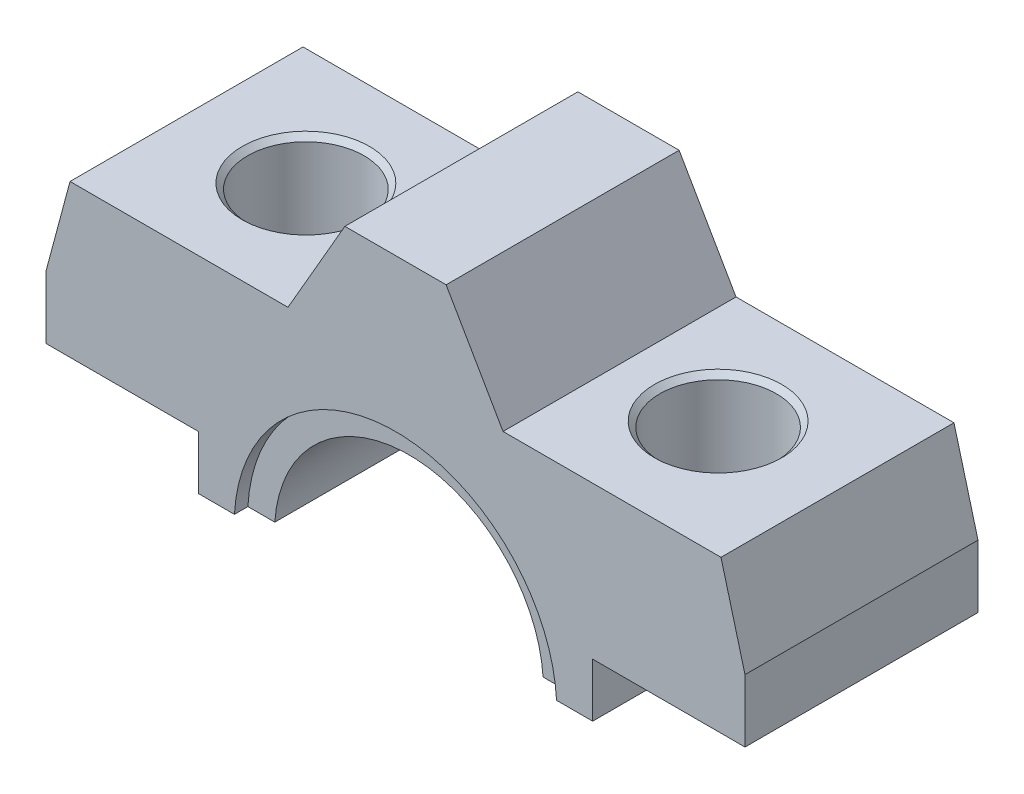
ISO-10303-21;
HEADER;
FILE_DESCRIPTION(('STEP AP214'),'2;1');
FILE_NAME('part.step','',(''),(''),'','','');
FILE_SCHEMA(('AUTOMOTIVE_DESIGN { 1 0 10303 214 1 1 1 1 }'));
ENDSEC;
DATA;
#1=APPLICATION_CONTEXT('core data for automotive mechanical design processes');
#2=APPLICATION_PROTOCOL_DEFINITION('international standard','automotive_design',2000,#1);
#3=PRODUCT_CONTEXT('',#1,'mechanical');
#4=PRODUCT('Part','Part','',(#3));
#5=PRODUCT_RELATED_PRODUCT_CATEGORY('part','',(#4));
#6=PRODUCT_DEFINITION_FORMATION('','',#4);
#7=PRODUCT_DEFINITION_CONTEXT('part definition',#1,'design');
#8=PRODUCT_DEFINITION('design','',#6,#7);
#9=PRODUCT_DEFINITION_SHAPE('','',#8);
#10=(LENGTH_UNIT() NAMED_UNIT(*) SI_UNIT(.MILLI.,.METRE.));
#11=(NAMED_UNIT(*) PLANE_ANGLE_UNIT() SI_UNIT($,.RADIAN.));
#12=(NAMED_UNIT(*) SI_UNIT($,.STERADIAN.) SOLID_ANGLE_UNIT());
#13=UNCERTAINTY_MEASURE_WITH_UNIT(LENGTH_MEASURE(1.E-05),#10,'distance_accuracy_value','');
#14=(GEOMETRIC_REPRESENTATION_CONTEXT(3) GLOBAL_UNCERTAINTY_ASSIGNED_CONTEXT((#13)) GLOBAL_UNIT_ASSIGNED_CONTEXT((#10,
#11,#12)) REPRESENTATION_CONTEXT('',''));
#15=CARTESIAN_POINT('',(0.,0.,0.));
#16=DIRECTION('',(0.,0.,1.));
#17=DIRECTION('',(1.,0.,0.));
#18=AXIS2_PLACEMENT_3D('',#15,#16,#17);
#19=CARTESIAN_POINT('',(22.,1.,-26.));
#20=DIRECTION('',(1.,0.,0.));
#21=DIRECTION('',(0.,0.,-1.));
#22=AXIS2_PLACEMENT_3D('',#19,#20,#21);
#23=PLANE('',#22);
#24=DIRECTION('',(0.,1.,0.));
#25=VECTOR('',#24,1.);
#26=CARTESIAN_POINT('',(22.,1.,-19.4226162893326));
#27=LINE('',#26,#25);
#28=CARTESIAN_POINT('',(22.,1.,-19.4226162893326));
#29=VERTEX_POINT('',#28);
#30=CARTESIAN_POINT('',(22.,7.,-19.4226162893326));
#31=VERTEX_POINT('',#30);
#32=EDGE_CURVE('E199',#29,#31,#27,.T.);
#33=ORIENTED_EDGE('',*,*,#32,.F.);
#34=DIRECTION('',(0.,0.,1.));
#35=VECTOR('',#34,1.);
#36=CARTESIAN_POINT('',(22.,1.,-26.));
#37=LINE('',#36,#35);
#38=CARTESIAN_POINT('',(22.,1.,-26.));
#39=VERTEX_POINT('',#38);
#40=EDGE_CURVE('E209',#39,#29,#37,.T.);
#41=ORIENTED_EDGE('',*,*,#40,.F.);
#42=DIRECTION('',(0.,1.,0.));
#43=VECTOR('',#42,1.);
#44=CARTESIAN_POINT('',(22.,1.,-26.));
#45=LINE('',#44,#43);
#46=CARTESIAN_POINT('',(22.,7.,-26.));
#47=VERTEX_POINT('',#46);
#48=EDGE_CURVE('E420',#39,#47,#45,.T.);
#49=ORIENTED_EDGE('',*,*,#48,.T.);
#50=DIRECTION('',(0.,0.,1.));
#51=VECTOR('',#50,1.);
#52=CARTESIAN_POINT('',(22.,7.,-26.));
#53=LINE('',#52,#51);
#54=EDGE_CURVE('E211',#47,#31,#53,.T.);
#55=ORIENTED_EDGE('',*,*,#54,.T.);
#56=EDGE_LOOP('',(#33,#41,#49,#55));
#57=FACE_BOUND('',#56,.T.);
#58=ADVANCED_FACE('F37',(#57),#23,.T.);
#59=CARTESIAN_POINT('',(-22.,7.,-26.));
#60=DIRECTION('',(-1.,0.,0.));
#61=DIRECTION('',(0.,0.,1.));
#62=AXIS2_PLACEMENT_3D('',#59,#60,#61);
#63=PLANE('',#62);
#64=DIRECTION('',(0.,1.,0.));
#65=VECTOR('',#64,1.);
#66=CARTESIAN_POINT('',(-22.,1.,-6.57738371066743));
#67=LINE('',#66,#65);
#68=CARTESIAN_POINT('',(-22.,1.,-6.57738371066743));
#69=VERTEX_POINT('',#68);
#70=CARTESIAN_POINT('',(-22.,7.,-6.57738371066743));
#71=VERTEX_POINT('',#70);
#72=EDGE_CURVE('E60',#69,#71,#67,.T.);
#73=ORIENTED_EDGE('',*,*,#72,.F.);
#74=DIRECTION('',(0.,0.,1.));
#75=VECTOR('',#74,1.);
#76=CARTESIAN_POINT('',(-22.,1.,-26.));
#77=LINE('',#76,#75);
#78=CARTESIAN_POINT('',(-22.,1.,0.));
#79=VERTEX_POINT('',#78);
#80=EDGE_CURVE('E227',#69,#79,#77,.T.);
#81=ORIENTED_EDGE('',*,*,#80,.T.);
#82=DIRECTION('',(0.,-1.,0.));
#83=VECTOR('',#82,1.);
#84=CARTESIAN_POINT('',(-22.,7.,0.));
#85=LINE('',#84,#83);
#86=CARTESIAN_POINT('',(-22.,7.,0.));
#87=VERTEX_POINT('',#86);
#88=EDGE_CURVE('E435',#87,#79,#85,.T.);
#89=ORIENTED_EDGE('',*,*,#88,.F.);
#90=DIRECTION('',(0.,0.,1.));
#91=VECTOR('',#90,1.);
#92=CARTESIAN_POINT('',(-22.,7.,-26.));
#93=LINE('',#92,#91);
#94=EDGE_CURVE('E231',#71,#87,#93,.T.);
#95=ORIENTED_EDGE('',*,*,#94,.F.);
#96=EDGE_LOOP('',(#73,#81,#89,#95));
#97=FACE_BOUND('',#96,.T.);
#98=ADVANCED_FACE('F264',(#97),#63,.T.);
#99=CARTESIAN_POINT('',(0.,0.,-26.));
#100=DIRECTION('',(0.,0.,1.));
#101=DIRECTION('',(1.,0.,0.));
#102=AXIS2_PLACEMENT_3D('',#99,#100,#101);
#103=CYLINDRICAL_SURFACE('',#102,15.);
#104=CARTESIAN_POINT('',(0.,0.,-24.5));
#105=DIRECTION('',(0.,0.,-1.));
#106=DIRECTION('',(-1.,0.,0.));
#107=AXIS2_PLACEMENT_3D('',#104,#105,#106);
#108=CIRCLE('',#107,15.);
#109=CARTESIAN_POINT('',(14.9666295470958,1.,-24.5));
#110=VERTEX_POINT('',#109);
#111=CARTESIAN_POINT('',(-14.9666295470958,1.,-24.5));
#112=VERTEX_POINT('',#111);
#113=EDGE_CURVE('E386',#110,#112,#108,.F.);
#114=ORIENTED_EDGE('',*,*,#113,.F.);
#115=DIRECTION('',(0.,0.,1.));
#116=VECTOR('',#115,1.);
#117=CARTESIAN_POINT('',(14.9666295470958,1.,-26.));
#118=LINE('',#117,#116);
#119=CARTESIAN_POINT('',(14.9666295470958,1.,-1.5));
#120=VERTEX_POINT('',#119);
#121=EDGE_CURVE('E409',#110,#120,#118,.T.);
#122=ORIENTED_EDGE('',*,*,#121,.T.);
#123=CARTESIAN_POINT('',(0.,0.,-1.5));
#124=DIRECTION('',(0.,0.,1.));
#125=DIRECTION('',(1.,0.,0.));
#126=AXIS2_PLACEMENT_3D('',#123,#124,#125);
#127=CIRCLE('',#126,15.);
#128=CARTESIAN_POINT('',(-14.9666295470958,1.,-1.50000000000001));
#129=VERTEX_POINT('',#128);
#130=EDGE_CURVE('E236',#129,#120,#127,.F.);
#131=ORIENTED_EDGE('',*,*,#130,.F.);
#132=DIRECTION('',(0.,0.,1.));
#133=VECTOR('',#132,1.);
#134=CARTESIAN_POINT('',(-14.9666295470958,1.,-26.));
#135=LINE('',#134,#133);
#136=EDGE_CURVE('E406',#129,#112,#135,.F.);
#137=ORIENTED_EDGE('',*,*,#136,.T.);
#138=EDGE_LOOP('',(#114,#122,#131,#137));
#139=FACE_BOUND('',#138,.T.);
#140=ADVANCED_FACE('F270',(#139),#103,.F.);
#141=CARTESIAN_POINT('',(-22.,1.,-26.));
#142=DIRECTION('',(0.,-1.,0.));
#143=DIRECTION('',(0.,0.,-1.));
#144=AXIS2_PLACEMENT_3D('',#141,#142,#143);
#145=PLANE('',#144);
#146=CARTESIAN_POINT('',(23.,1.,-13.));
#147=DIRECTION('',(0.,1.,0.));
#148=DIRECTION('',(0.,0.,1.));
#149=AXIS2_PLACEMENT_3D('',#146,#147,#148);
#150=CIRCLE('',#149,6.5);
#151=CARTESIAN_POINT('',(22.,1.,-6.57738371066743));
#152=VERTEX_POINT('',#151);
#153=EDGE_CURVE('E196',#29,#152,#150,.T.);
#154=ORIENTED_EDGE('',*,*,#153,.T.);
#155=CARTESIAN_POINT('',(22.,1.,0.));
#156=VERTEX_POINT('',#155);
#157=EDGE_CURVE('E219',#152,#156,#37,.T.);
#158=ORIENTED_EDGE('',*,*,#157,.T.);
#159=DIRECTION('',(1.,0.,0.));
#160=VECTOR('',#159,1.);
#161=CARTESIAN_POINT('',(-22.,1.,0.));
#162=LINE('',#161,#160);
#163=CARTESIAN_POINT('',(17.9722007556114,1.,0.));
#164=VERTEX_POINT('',#163);
#165=EDGE_CURVE('E306',#164,#156,#162,.T.);
#166=ORIENTED_EDGE('',*,*,#165,.F.);
#167=DIRECTION('',(0.,0.,1.));
#168=VECTOR('',#167,1.);
#169=CARTESIAN_POINT('',(17.9722007556114,1.,-1.5));
#170=LINE('',#169,#168);
#171=CARTESIAN_POINT('',(17.9722007556114,1.,-1.5));
#172=VERTEX_POINT('',#171);
#173=EDGE_CURVE('E404',#172,#164,#170,.T.);
#174=ORIENTED_EDGE('',*,*,#173,.F.);
#175=DIRECTION('',(-1.,0.,0.));
#176=VECTOR('',#175,1.);
#177=CARTESIAN_POINT('',(-22.,1.,-1.5));
#178=LINE('',#177,#176);
#179=EDGE_CURVE('E399',#172,#120,#178,.T.);
#180=ORIENTED_EDGE('',*,*,#179,.T.);
#181=ORIENTED_EDGE('',*,*,#121,.F.);
#182=DIRECTION('',(1.,0.,0.));
#183=VECTOR('',#182,1.);
#184=CARTESIAN_POINT('',(-22.,1.,-24.5));
#185=LINE('',#184,#183);
#186=CARTESIAN_POINT('',(17.9722007556114,1.,-24.5));
#187=VERTEX_POINT('',#186);
#188=EDGE_CURVE('E388',#110,#187,#185,.T.);
#189=ORIENTED_EDGE('',*,*,#188,.T.);
#190=DIRECTION('',(0.,0.,-1.));
#191=VECTOR('',#190,1.);
#192=CARTESIAN_POINT('',(17.9722007556114,1.,-24.5));
#193=LINE('',#192,#191);
#194=CARTESIAN_POINT('',(17.9722007556114,1.,-26.));
#195=VERTEX_POINT('',#194);
#196=EDGE_CURVE('E384',#195,#187,#193,.F.);
#197=ORIENTED_EDGE('',*,*,#196,.F.);
#198=DIRECTION('',(1.,0.,0.));
#199=VECTOR('',#198,1.);
#200=CARTESIAN_POINT('',(-22.,1.,-26.));
#201=LINE('',#200,#199);
#202=EDGE_CURVE('E217',#195,#39,#201,.T.);
#203=ORIENTED_EDGE('',*,*,#202,.T.);
#204=ORIENTED_EDGE('',*,*,#40,.T.);
#205=EDGE_LOOP('',(#154,#158,#166,#174,#180,#181,#189,#197,#203,#204));
#206=FACE_BOUND('',#205,.T.);
#207=ADVANCED_FACE('F214',(#206),#145,.T.);
#208=CARTESIAN_POINT('',(-35.0998575495685,24.,-26.));
#209=DIRECTION('',(0.,1.,0.));
#210=DIRECTION('',(0.,0.,1.));
#211=AXIS2_PLACEMENT_3D('',#208,#209,#210);
#212=PLANE('',#211);
#213=CARTESIAN_POINT('',(-23.,24.,-13.));
#214=DIRECTION('',(0.,1.,0.));
#215=DIRECTION('',(0.,0.,1.));
#216=AXIS2_PLACEMENT_3D('',#213,#214,#215);
#217=CIRCLE('',#216,7.09999999999998);
#218=CARTESIAN_POINT('',(-23.,24.,-5.90000000000002));
#219=VERTEX_POINT('',#218);
#220=EDGE_CURVE('E11',#219,#219,#217,.F.);
#221=ORIENTED_EDGE('',*,*,#220,.T.);
#222=EDGE_LOOP('',(#221));
#223=FACE_BOUND('',#222,.T.);
#224=DIRECTION('',(-1.,0.,0.));
#225=VECTOR('',#224,1.);
#226=CARTESIAN_POINT('',(-35.0998575495685,24.,-26.));
#227=LINE('',#226,#225);
#228=CARTESIAN_POINT('',(-12.,24.,-26.));
#229=VERTEX_POINT('',#228);
#230=CARTESIAN_POINT('',(-36.3205080756888,24.,-26.));
#231=VERTEX_POINT('',#230);
#232=EDGE_CURVE('E235',#229,#231,#227,.T.);
#233=ORIENTED_EDGE('',*,*,#232,.T.);
#234=DIRECTION('',(0.,0.,1.));
#235=VECTOR('',#234,1.);
#236=CARTESIAN_POINT('',(-36.3205080756888,24.,-50.0416305603426));
#237=LINE('',#236,#235);
#238=CARTESIAN_POINT('',(-36.3205080756888,24.,0.));
#239=VERTEX_POINT('',#238);
#240=EDGE_CURVE('E366',#231,#239,#237,.T.);
#241=ORIENTED_EDGE('',*,*,#240,.T.);
#242=DIRECTION('',(-1.,0.,0.));
#243=VECTOR('',#242,1.);
#244=CARTESIAN_POINT('',(-35.0998575495685,24.,0.));
#245=LINE('',#244,#243);
#246=CARTESIAN_POINT('',(-12.,24.,0.));
#247=VERTEX_POINT('',#246);
#248=EDGE_CURVE('E323',#247,#239,#245,.T.);
#249=ORIENTED_EDGE('',*,*,#248,.F.);
#250=DIRECTION('',(0.,0.,1.));
#251=VECTOR('',#250,1.);
#252=CARTESIAN_POINT('',(-12.,24.,-26.));
#253=LINE('',#252,#251);
#254=EDGE_CURVE('E240',#229,#247,#253,.T.);
#255=ORIENTED_EDGE('',*,*,#254,.F.);
#256=EDGE_LOOP('',(#233,#241,#249,#255));
#257=FACE_BOUND('',#256,.T.);
#258=ADVANCED_FACE('F497',(#223,#257),#212,.T.);
#259=CARTESIAN_POINT('',(-12.,24.,-26.));
#260=DIRECTION('',(-0.866025403784442,0.499999999999995,0.));
#261=DIRECTION('',(-0.499999999999995,-0.866025403784442,0.));
#262=AXIS2_PLACEMENT_3D('',#259,#260,#261);
#263=PLANE('',#262);
#264=DIRECTION('',(-0.499999999999995,-0.866025403784442,0.));
#265=VECTOR('',#264,1.);
#266=CARTESIAN_POINT('',(-12.,24.,0.));
#267=LINE('',#266,#265);
#268=CARTESIAN_POINT('',(-5.6491470389142,35.,0.));
#269=VERTEX_POINT('',#268);
#270=EDGE_CURVE('E320',#269,#247,#267,.T.);
#271=ORIENTED_EDGE('',*,*,#270,.F.);
#272=DIRECTION('',(0.,0.,1.));
#273=VECTOR('',#272,1.);
#274=CARTESIAN_POINT('',(-5.6491470389142,35.,-26.));
#275=LINE('',#274,#273);
#276=CARTESIAN_POINT('',(-5.6491470389142,35.,-26.));
#277=VERTEX_POINT('',#276);
#278=EDGE_CURVE('E327',#277,#269,#275,.T.);
#279=ORIENTED_EDGE('',*,*,#278,.F.);
#280=DIRECTION('',(-0.499999999999995,-0.866025403784442,0.));
#281=VECTOR('',#280,1.);
#282=CARTESIAN_POINT('',(-12.,24.,-26.));
#283=LINE('',#282,#281);
#284=EDGE_CURVE('E430',#277,#229,#283,.T.);
#285=ORIENTED_EDGE('',*,*,#284,.T.);
#286=ORIENTED_EDGE('',*,*,#254,.T.);
#287=EDGE_LOOP('',(#271,#279,#285,#286));
#288=FACE_BOUND('',#287,.T.);
#289=ADVANCED_FACE('F500',(#288),#263,.T.);
#290=CARTESIAN_POINT('',(-5.6491470389142,35.,-26.));
#291=DIRECTION('',(0.,1.,0.));
#292=DIRECTION('',(0.,0.,1.));
#293=AXIS2_PLACEMENT_3D('',#290,#291,#292);
#294=PLANE('',#293);
#295=DIRECTION('',(-1.,0.,0.));
#296=VECTOR('',#295,1.);
#297=CARTESIAN_POINT('',(-5.6491470389142,35.,0.));
#298=LINE('',#297,#296);
#299=CARTESIAN_POINT('',(5.6491470389142,35.,0.));
#300=VERTEX_POINT('',#299);
#301=EDGE_CURVE('E317',#300,#269,#298,.T.);
#302=ORIENTED_EDGE('',*,*,#301,.F.);
#303=DIRECTION('',(0.,0.,1.));
#304=VECTOR('',#303,1.);
#305=CARTESIAN_POINT('',(5.6491470389142,35.,-26.));
#306=LINE('',#305,#304);
#307=CARTESIAN_POINT('',(5.6491470389142,35.,-26.));
#308=VERTEX_POINT('',#307);
#309=EDGE_CURVE('E329',#308,#300,#306,.T.);
#310=ORIENTED_EDGE('',*,*,#309,.F.);
#311=DIRECTION('',(-1.,0.,0.));
#312=VECTOR('',#311,1.);
#313=CARTESIAN_POINT('',(-5.6491470389142,35.,-26.));
#314=LINE('',#313,#312);
#315=EDGE_CURVE('E427',#308,#277,#314,.T.);
#316=ORIENTED_EDGE('',*,*,#315,.T.);
#317=ORIENTED_EDGE('',*,*,#278,.T.);
#318=EDGE_LOOP('',(#302,#310,#316,#317));
#319=FACE_BOUND('',#318,.T.);
#320=ADVANCED_FACE('F502',(#319),#294,.T.);
#321=CARTESIAN_POINT('',(5.6491470389142,35.,-26.));
#322=DIRECTION('',(0.866025403784442,0.499999999999995,0.));
#323=DIRECTION('',(-0.499999999999995,0.866025403784442,0.));
#324=AXIS2_PLACEMENT_3D('',#321,#322,#323);
#325=PLANE('',#324);
#326=DIRECTION('',(-0.499999999999995,0.866025403784442,0.));
#327=VECTOR('',#326,1.);
#328=CARTESIAN_POINT('',(5.6491470389142,35.,0.));
#329=LINE('',#328,#327);
#330=CARTESIAN_POINT('',(12.,24.,0.));
#331=VERTEX_POINT('',#330);
#332=EDGE_CURVE('E314',#331,#300,#329,.T.);
#333=ORIENTED_EDGE('',*,*,#332,.F.);
#334=DIRECTION('',(0.,0.,1.));
#335=VECTOR('',#334,1.);
#336=CARTESIAN_POINT('',(12.,24.,-26.));
#337=LINE('',#336,#335);
#338=CARTESIAN_POINT('',(12.,24.,-26.));
#339=VERTEX_POINT('',#338);
#340=EDGE_CURVE('E331',#339,#331,#337,.T.);
#341=ORIENTED_EDGE('',*,*,#340,.F.);
#342=DIRECTION('',(-0.499999999999995,0.866025403784442,0.));
#343=VECTOR('',#342,1.);
#344=CARTESIAN_POINT('',(5.6491470389142,35.,-26.));
#345=LINE('',#344,#343);
#346=EDGE_CURVE('E425',#339,#308,#345,.T.);
#347=ORIENTED_EDGE('',*,*,#346,.T.);
#348=ORIENTED_EDGE('',*,*,#309,.T.);
#349=EDGE_LOOP('',(#333,#341,#347,#348));
#350=FACE_BOUND('',#349,.T.);
#351=ADVANCED_FACE('F342',(#350),#325,.T.);
#352=CARTESIAN_POINT('',(12.,24.,-26.));
#353=DIRECTION('',(0.,1.,0.));
#354=DIRECTION('',(0.,0.,1.));
#355=AXIS2_PLACEMENT_3D('',#352,#353,#354);
#356=PLANE('',#355);
#357=CARTESIAN_POINT('',(23.,24.,-13.));
#358=DIRECTION('',(0.,1.,0.));
#359=DIRECTION('',(0.,0.,1.));
#360=AXIS2_PLACEMENT_3D('',#357,#358,#359);
#361=CIRCLE('',#360,7.09999999999998);
#362=CARTESIAN_POINT('',(23.,24.,-5.90000000000002));
#363=VERTEX_POINT('',#362);
#364=EDGE_CURVE('E248',#363,#363,#361,.F.);
#365=ORIENTED_EDGE('',*,*,#364,.T.);
#366=EDGE_LOOP('',(#365));
#367=FACE_BOUND('',#366,.T.);
#368=ORIENTED_EDGE('',*,*,#340,.T.);
#369=DIRECTION('',(-1.,0.,0.));
#370=VECTOR('',#369,1.);
#371=CARTESIAN_POINT('',(12.,24.,0.));
#372=LINE('',#371,#370);
#373=CARTESIAN_POINT('',(36.3205080756888,24.,0.));
#374=VERTEX_POINT('',#373);
#375=EDGE_CURVE('E299',#374,#331,#372,.T.);
#376=ORIENTED_EDGE('',*,*,#375,.F.);
#377=DIRECTION('',(0.,0.,1.));
#378=VECTOR('',#377,1.);
#379=CARTESIAN_POINT('',(36.3205080756888,24.,-50.0416305603426));
#380=LINE('',#379,#378);
#381=CARTESIAN_POINT('',(36.3205080756888,24.,-26.));
#382=VERTEX_POINT('',#381);
#383=EDGE_CURVE('E352',#382,#374,#380,.T.);
#384=ORIENTED_EDGE('',*,*,#383,.F.);
#385=DIRECTION('',(-1.,0.,0.));
#386=VECTOR('',#385,1.);
#387=CARTESIAN_POINT('',(12.,24.,-26.));
#388=LINE('',#387,#386);
#389=EDGE_CURVE('E338',#382,#339,#388,.T.);
#390=ORIENTED_EDGE('',*,*,#389,.T.);
#391=EDGE_LOOP('',(#368,#376,#384,#390));
#392=FACE_BOUND('',#391,.T.);
#393=ADVANCED_FACE('F285',(#367,#392),#356,.T.);
#394=CARTESIAN_POINT('',(22.,7.,-26.));
#395=DIRECTION('',(0.,-1.,0.));
#396=DIRECTION('',(0.,0.,-1.));
#397=AXIS2_PLACEMENT_3D('',#394,#395,#396);
#398=PLANE('',#397);
#399=CARTESIAN_POINT('',(23.,7.,-13.));
#400=DIRECTION('',(0.,-1.,0.));
#401=DIRECTION('',(0.,0.,-1.));
#402=AXIS2_PLACEMENT_3D('',#399,#400,#401);
#403=CIRCLE('',#402,6.5);
#404=CARTESIAN_POINT('',(22.,7.,-6.57738371066744));
#405=VERTEX_POINT('',#404);
#406=EDGE_CURVE('E52',#31,#405,#403,.T.);
#407=ORIENTED_EDGE('',*,*,#406,.F.);
#408=ORIENTED_EDGE('',*,*,#54,.F.);
#409=DIRECTION('',(1.,0.,0.));
#410=VECTOR('',#409,1.);
#411=CARTESIAN_POINT('',(22.,7.,-26.));
#412=LINE('',#411,#410);
#413=CARTESIAN_POINT('',(39.,7.,-26.));
#414=VERTEX_POINT('',#413);
#415=EDGE_CURVE('E422',#47,#414,#412,.T.);
#416=ORIENTED_EDGE('',*,*,#415,.T.);
#417=DIRECTION('',(0.,0.,1.));
#418=VECTOR('',#417,1.);
#419=CARTESIAN_POINT('',(39.,7.,-26.));
#420=LINE('',#419,#418);
#421=CARTESIAN_POINT('',(39.,7.,0.));
#422=VERTEX_POINT('',#421);
#423=EDGE_CURVE('E296',#414,#422,#420,.T.);
#424=ORIENTED_EDGE('',*,*,#423,.T.);
#425=DIRECTION('',(1.,0.,0.));
#426=VECTOR('',#425,1.);
#427=CARTESIAN_POINT('',(22.,7.,0.));
#428=LINE('',#427,#426);
#429=CARTESIAN_POINT('',(22.,7.,0.));
#430=VERTEX_POINT('',#429);
#431=EDGE_CURVE('E292',#430,#422,#428,.T.);
#432=ORIENTED_EDGE('',*,*,#431,.F.);
#433=EDGE_CURVE('E218',#405,#430,#53,.T.);
#434=ORIENTED_EDGE('',*,*,#433,.F.);
#435=EDGE_LOOP('',(#407,#408,#416,#424,#432,#434));
#436=FACE_BOUND('',#435,.T.);
#437=ADVANCED_FACE('F278',(#436),#398,.T.);
#438=DIRECTION('',(0.,1.,0.));
#439=VECTOR('',#438,1.);
#440=CARTESIAN_POINT('',(22.,1.,-6.57738371066743));
#441=LINE('',#440,#439);
#442=EDGE_CURVE('E200',#405,#152,#441,.F.);
#443=ORIENTED_EDGE('',*,*,#442,.F.);
#444=ORIENTED_EDGE('',*,*,#433,.T.);
#445=DIRECTION('',(0.,1.,0.));
#446=VECTOR('',#445,1.);
#447=CARTESIAN_POINT('',(22.,1.,0.));
#448=LINE('',#447,#446);
#449=EDGE_CURVE('E300',#156,#430,#448,.T.);
#450=ORIENTED_EDGE('',*,*,#449,.F.);
#451=ORIENTED_EDGE('',*,*,#157,.F.);
#452=EDGE_LOOP('',(#443,#444,#450,#451));
#453=FACE_BOUND('',#452,.T.);
#454=ADVANCED_FACE('F266',(#453),#23,.T.);
#455=CARTESIAN_POINT('',(-23.,1.,-13.));
#456=DIRECTION('',(0.,1.,0.));
#457=DIRECTION('',(0.,0.,1.));
#458=AXIS2_PLACEMENT_3D('',#455,#456,#457);
#459=CIRCLE('',#458,6.5);
#460=CARTESIAN_POINT('',(-22.,1.,-19.4226162893326));
#461=VERTEX_POINT('',#460);
#462=EDGE_CURVE('E475',#69,#461,#459,.T.);
#463=ORIENTED_EDGE('',*,*,#462,.T.);
#464=CARTESIAN_POINT('',(-22.,1.,-26.));
#465=VERTEX_POINT('',#464);
#466=EDGE_CURVE('E222',#465,#461,#77,.T.);
#467=ORIENTED_EDGE('',*,*,#466,.F.);
#468=CARTESIAN_POINT('',(-17.9722007556114,1.,-26.));
#469=VERTEX_POINT('',#468);
#470=EDGE_CURVE('E417',#465,#469,#201,.T.);
#471=ORIENTED_EDGE('',*,*,#470,.T.);
#472=DIRECTION('',(0.,0.,-1.));
#473=VECTOR('',#472,1.);
#474=CARTESIAN_POINT('',(-17.9722007556114,1.,-24.5));
#475=LINE('',#474,#473);
#476=CARTESIAN_POINT('',(-17.9722007556114,1.,-24.5));
#477=VERTEX_POINT('',#476);
#478=EDGE_CURVE('E381',#477,#469,#475,.T.);
#479=ORIENTED_EDGE('',*,*,#478,.F.);
#480=DIRECTION('',(1.,0.,0.));
#481=VECTOR('',#480,1.);
#482=CARTESIAN_POINT('',(-22.,1.,-24.5));
#483=LINE('',#482,#481);
#484=EDGE_CURVE('E239',#477,#112,#483,.T.);
#485=ORIENTED_EDGE('',*,*,#484,.T.);
#486=ORIENTED_EDGE('',*,*,#136,.F.);
#487=DIRECTION('',(-1.,0.,0.));
#488=VECTOR('',#487,1.);
#489=CARTESIAN_POINT('',(-22.,1.,-1.5));
#490=LINE('',#489,#488);
#491=CARTESIAN_POINT('',(-17.9722007556114,1.,-1.5));
#492=VERTEX_POINT('',#491);
#493=EDGE_CURVE('E395',#129,#492,#490,.T.);
#494=ORIENTED_EDGE('',*,*,#493,.T.);
#495=DIRECTION('',(0.,0.,1.));
#496=VECTOR('',#495,1.);
#497=CARTESIAN_POINT('',(-17.9722007556114,1.,-1.5));
#498=LINE('',#497,#496);
#499=CARTESIAN_POINT('',(-17.9722007556114,1.,0.));
#500=VERTEX_POINT('',#499);
#501=EDGE_CURVE('E402',#500,#492,#498,.F.);
#502=ORIENTED_EDGE('',*,*,#501,.F.);
#503=EDGE_CURVE('E307',#79,#500,#162,.T.);
#504=ORIENTED_EDGE('',*,*,#503,.F.);
#505=ORIENTED_EDGE('',*,*,#80,.F.);
#506=EDGE_LOOP('',(#463,#467,#471,#479,#485,#486,#494,#502,#504,#505));
#507=FACE_BOUND('',#506,.T.);
#508=ADVANCED_FACE('F277',(#507),#145,.T.);
#509=DIRECTION('',(0.,1.,0.));
#510=VECTOR('',#509,1.);
#511=CARTESIAN_POINT('',(-22.,1.,-19.4226162893326));
#512=LINE('',#511,#510);
#513=CARTESIAN_POINT('',(-22.,7.,-19.4226162893326));
#514=VERTEX_POINT('',#513);
#515=EDGE_CURVE('E473',#514,#461,#512,.F.);
#516=ORIENTED_EDGE('',*,*,#515,.F.);
#517=CARTESIAN_POINT('',(-22.,7.,-26.));
#518=VERTEX_POINT('',#517);
#519=EDGE_CURVE('E228',#518,#514,#93,.T.);
#520=ORIENTED_EDGE('',*,*,#519,.F.);
#521=DIRECTION('',(0.,-1.,0.));
#522=VECTOR('',#521,1.);
#523=CARTESIAN_POINT('',(-22.,7.,-26.));
#524=LINE('',#523,#522);
#525=EDGE_CURVE('E414',#518,#465,#524,.T.);
#526=ORIENTED_EDGE('',*,*,#525,.T.);
#527=ORIENTED_EDGE('',*,*,#466,.T.);
#528=EDGE_LOOP('',(#516,#520,#526,#527));
#529=FACE_BOUND('',#528,.T.);
#530=ADVANCED_FACE('F273',(#529),#63,.T.);
#531=CARTESIAN_POINT('',(-39.,7.,-26.));
#532=DIRECTION('',(0.,-1.,0.));
#533=DIRECTION('',(0.,0.,-1.));
#534=AXIS2_PLACEMENT_3D('',#531,#532,#533);
#535=PLANE('',#534);
#536=CARTESIAN_POINT('',(-23.,7.,-13.));
#537=DIRECTION('',(0.,-1.,0.));
#538=DIRECTION('',(0.,0.,-1.));
#539=AXIS2_PLACEMENT_3D('',#536,#537,#538);
#540=CIRCLE('',#539,6.5);
#541=EDGE_CURVE('E243',#71,#514,#540,.T.);
#542=ORIENTED_EDGE('',*,*,#541,.F.);
#543=ORIENTED_EDGE('',*,*,#94,.T.);
#544=DIRECTION('',(1.,0.,0.));
#545=VECTOR('',#544,1.);
#546=CARTESIAN_POINT('',(-39.,7.,0.));
#547=LINE('',#546,#545);
#548=CARTESIAN_POINT('',(-39.,7.,0.));
#549=VERTEX_POINT('',#548);
#550=EDGE_CURVE('E411',#549,#87,#547,.T.);
#551=ORIENTED_EDGE('',*,*,#550,.F.);
#552=DIRECTION('',(0.,0.,1.));
#553=VECTOR('',#552,1.);
#554=CARTESIAN_POINT('',(-39.,7.,-26.));
#555=LINE('',#554,#553);
#556=CARTESIAN_POINT('',(-39.,7.,-26.));
#557=VERTEX_POINT('',#556);
#558=EDGE_CURVE('E232',#557,#549,#555,.T.);
#559=ORIENTED_EDGE('',*,*,#558,.F.);
#560=DIRECTION('',(1.,0.,0.));
#561=VECTOR('',#560,1.);
#562=CARTESIAN_POINT('',(-39.,7.,-26.));
#563=LINE('',#562,#561);
#564=EDGE_CURVE('E325',#557,#518,#563,.T.);
#565=ORIENTED_EDGE('',*,*,#564,.T.);
#566=ORIENTED_EDGE('',*,*,#519,.T.);
#567=EDGE_LOOP('',(#542,#543,#551,#559,#565,#566));
#568=FACE_BOUND('',#567,.T.);
#569=ADVANCED_FACE('F482',(#568),#535,.T.);
#570=CARTESIAN_POINT('',(0.,7.,-26.));
#571=DIRECTION('',(0.,0.,1.));
#572=DIRECTION('',(1.,0.,0.));
#573=AXIS2_PLACEMENT_3D('',#570,#571,#572);
#574=PLANE('',#573);
#575=ORIENTED_EDGE('',*,*,#346,.F.);
#576=ORIENTED_EDGE('',*,*,#389,.F.);
#577=DIRECTION('',(0.258819045102522,-0.965925826289068,0.));
#578=VECTOR('',#577,1.);
#579=CARTESIAN_POINT('',(39.,14.,-26.));
#580=LINE('',#579,#578);
#581=CARTESIAN_POINT('',(39.,14.,-26.));
#582=VERTEX_POINT('',#581);
#583=EDGE_CURVE('E357',#382,#582,#580,.T.);
#584=ORIENTED_EDGE('',*,*,#583,.T.);
#585=DIRECTION('',(0.,-1.,0.));
#586=VECTOR('',#585,1.);
#587=CARTESIAN_POINT('',(39.,7.,-26.));
#588=LINE('',#587,#586);
#589=EDGE_CURVE('E359',#582,#414,#588,.T.);
#590=ORIENTED_EDGE('',*,*,#589,.T.);
#591=ORIENTED_EDGE('',*,*,#415,.F.);
#592=ORIENTED_EDGE('',*,*,#48,.F.);
#593=ORIENTED_EDGE('',*,*,#202,.F.);
#594=CARTESIAN_POINT('',(0.,0.,-26.));
#595=DIRECTION('',(0.,0.,-1.));
#596=DIRECTION('',(-1.,0.,0.));
#597=AXIS2_PLACEMENT_3D('',#594,#595,#596);
#598=CIRCLE('',#597,18.);
#599=EDGE_CURVE('E377',#469,#195,#598,.T.);
#600=ORIENTED_EDGE('',*,*,#599,.F.);
#601=ORIENTED_EDGE('',*,*,#470,.F.);
#602=ORIENTED_EDGE('',*,*,#525,.F.);
#603=ORIENTED_EDGE('',*,*,#564,.F.);
#604=DIRECTION('',(0.,1.,0.));
#605=VECTOR('',#604,1.);
#606=CARTESIAN_POINT('',(-39.,7.,-26.));
#607=LINE('',#606,#605);
#608=CARTESIAN_POINT('',(-39.,14.,-26.));
#609=VERTEX_POINT('',#608);
#610=EDGE_CURVE('E365',#557,#609,#607,.T.);
#611=ORIENTED_EDGE('',*,*,#610,.T.);
#612=DIRECTION('',(0.258819045102522,0.965925826289068,0.));
#613=VECTOR('',#612,1.);
#614=CARTESIAN_POINT('',(-39.,14.,-26.));
#615=LINE('',#614,#613);
#616=EDGE_CURVE('E362',#609,#231,#615,.T.);
#617=ORIENTED_EDGE('',*,*,#616,.T.);
#618=ORIENTED_EDGE('',*,*,#232,.F.);
#619=ORIENTED_EDGE('',*,*,#284,.F.);
#620=ORIENTED_EDGE('',*,*,#315,.F.);
#621=EDGE_LOOP('',(#575,#576,#584,#590,#591,#592,#593,#600,#601,#602,#603,#611,#617,#618,#619,#620));
#622=FACE_BOUND('',#621,.T.);
#623=ADVANCED_FACE('F463',(#622),#574,.F.);
#624=CARTESIAN_POINT('',(0.,7.,0.));
#625=DIRECTION('',(0.,0.,1.));
#626=DIRECTION('',(1.,0.,0.));
#627=AXIS2_PLACEMENT_3D('',#624,#625,#626);
#628=PLANE('',#627);
#629=ORIENTED_EDGE('',*,*,#449,.T.);
#630=ORIENTED_EDGE('',*,*,#431,.T.);
#631=DIRECTION('',(0.,1.,0.));
#632=VECTOR('',#631,1.);
#633=CARTESIAN_POINT('',(39.,7.,0.));
#634=LINE('',#633,#632);
#635=CARTESIAN_POINT('',(39.,14.,0.));
#636=VERTEX_POINT('',#635);
#637=EDGE_CURVE('E347',#422,#636,#634,.T.);
#638=ORIENTED_EDGE('',*,*,#637,.T.);
#639=DIRECTION('',(-0.258819045102522,0.965925826289068,0.));
#640=VECTOR('',#639,1.);
#641=CARTESIAN_POINT('',(39.,14.,0.));
#642=LINE('',#641,#640);
#643=EDGE_CURVE('E346',#636,#374,#642,.T.);
#644=ORIENTED_EDGE('',*,*,#643,.T.);
#645=ORIENTED_EDGE('',*,*,#375,.T.);
#646=ORIENTED_EDGE('',*,*,#332,.T.);
#647=ORIENTED_EDGE('',*,*,#301,.T.);
#648=ORIENTED_EDGE('',*,*,#270,.T.);
#649=ORIENTED_EDGE('',*,*,#248,.T.);
#650=DIRECTION('',(-0.258819045102522,-0.965925826289068,0.));
#651=VECTOR('',#650,1.);
#652=CARTESIAN_POINT('',(-39.,14.,0.));
#653=LINE('',#652,#651);
#654=CARTESIAN_POINT('',(-39.,14.,0.));
#655=VERTEX_POINT('',#654);
#656=EDGE_CURVE('E361',#239,#655,#653,.T.);
#657=ORIENTED_EDGE('',*,*,#656,.T.);
#658=DIRECTION('',(0.,-1.,0.));
#659=VECTOR('',#658,1.);
#660=CARTESIAN_POINT('',(-39.,7.,0.));
#661=LINE('',#660,#659);
#662=EDGE_CURVE('E369',#655,#549,#661,.T.);
#663=ORIENTED_EDGE('',*,*,#662,.T.);
#664=ORIENTED_EDGE('',*,*,#550,.T.);
#665=ORIENTED_EDGE('',*,*,#88,.T.);
#666=ORIENTED_EDGE('',*,*,#503,.T.);
#667=CARTESIAN_POINT('',(0.,0.,0.));
#668=DIRECTION('',(0.,0.,1.));
#669=DIRECTION('',(1.,0.,0.));
#670=AXIS2_PLACEMENT_3D('',#667,#668,#669);
#671=CIRCLE('',#670,18.);
#672=EDGE_CURVE('E391',#164,#500,#671,.T.);
#673=ORIENTED_EDGE('',*,*,#672,.F.);
#674=ORIENTED_EDGE('',*,*,#165,.T.);
#675=EDGE_LOOP('',(#629,#630,#638,#644,#645,#646,#647,#648,#649,#657,#663,#664,#665,#666,#673,#674));
#676=FACE_BOUND('',#675,.T.);
#677=ADVANCED_FACE('F303',(#676),#628,.T.);
#678=CARTESIAN_POINT('',(0.,0.,-1.5));
#679=DIRECTION('',(0.,0.,1.));
#680=DIRECTION('',(1.,0.,0.));
#681=AXIS2_PLACEMENT_3D('',#678,#679,#680);
#682=CYLINDRICAL_SURFACE('',#681,18.);
#683=ORIENTED_EDGE('',*,*,#173,.T.);
#684=ORIENTED_EDGE('',*,*,#672,.T.);
#685=ORIENTED_EDGE('',*,*,#501,.T.);
#686=CARTESIAN_POINT('',(0.,0.,-1.5));
#687=DIRECTION('',(0.,0.,1.));
#688=DIRECTION('',(1.,0.,0.));
#689=AXIS2_PLACEMENT_3D('',#686,#687,#688);
#690=CIRCLE('',#689,18.);
#691=EDGE_CURVE('E392',#172,#492,#690,.T.);
#692=ORIENTED_EDGE('',*,*,#691,.F.);
#693=EDGE_LOOP('',(#683,#684,#685,#692));
#694=FACE_BOUND('',#693,.T.);
#695=ADVANCED_FACE('F446',(#694),#682,.F.);
#696=CARTESIAN_POINT('',(0.,0.,-1.5));
#697=DIRECTION('',(0.,0.,1.));
#698=DIRECTION('',(1.,0.,0.));
#699=AXIS2_PLACEMENT_3D('',#696,#697,#698);
#700=PLANE('',#699);
#701=ORIENTED_EDGE('',*,*,#691,.T.);
#702=ORIENTED_EDGE('',*,*,#493,.F.);
#703=ORIENTED_EDGE('',*,*,#130,.T.);
#704=ORIENTED_EDGE('',*,*,#179,.F.);
#705=EDGE_LOOP('',(#701,#702,#703,#704));
#706=FACE_BOUND('',#705,.T.);
#707=ADVANCED_FACE('F449',(#706),#700,.T.);
#708=CARTESIAN_POINT('',(0.,0.,-24.5));
#709=DIRECTION('',(0.,0.,-1.));
#710=DIRECTION('',(-1.,0.,0.));
#711=AXIS2_PLACEMENT_3D('',#708,#709,#710);
#712=CYLINDRICAL_SURFACE('',#711,18.);
#713=ORIENTED_EDGE('',*,*,#196,.T.);
#714=CARTESIAN_POINT('',(0.,0.,-24.5));
#715=DIRECTION('',(0.,0.,-1.));
#716=DIRECTION('',(-1.,0.,0.));
#717=AXIS2_PLACEMENT_3D('',#714,#715,#716);
#718=CIRCLE('',#717,18.);
#719=EDGE_CURVE('E378',#477,#187,#718,.T.);
#720=ORIENTED_EDGE('',*,*,#719,.F.);
#721=ORIENTED_EDGE('',*,*,#478,.T.);
#722=ORIENTED_EDGE('',*,*,#599,.T.);
#723=EDGE_LOOP('',(#713,#720,#721,#722));
#724=FACE_BOUND('',#723,.T.);
#725=ADVANCED_FACE('F461',(#724),#712,.F.);
#726=CARTESIAN_POINT('',(0.,0.,-24.5));
#727=DIRECTION('',(0.,0.,-1.));
#728=DIRECTION('',(-1.,0.,0.));
#729=AXIS2_PLACEMENT_3D('',#726,#727,#728);
#730=PLANE('',#729);
#731=ORIENTED_EDGE('',*,*,#113,.T.);
#732=ORIENTED_EDGE('',*,*,#484,.F.);
#733=ORIENTED_EDGE('',*,*,#719,.T.);
#734=ORIENTED_EDGE('',*,*,#188,.F.);
#735=EDGE_LOOP('',(#731,#732,#733,#734));
#736=FACE_BOUND('',#735,.T.);
#737=ADVANCED_FACE('F455',(#736),#730,.T.);
#738=CARTESIAN_POINT('',(-39.,14.,-50.0416305603426));
#739=DIRECTION('',(-0.965925826289068,0.258819045102522,0.));
#740=DIRECTION('',(-0.258819045102522,-0.965925826289068,0.));
#741=AXIS2_PLACEMENT_3D('',#738,#739,#740);
#742=PLANE('',#741);
#743=ORIENTED_EDGE('',*,*,#616,.F.);
#744=DIRECTION('',(0.,0.,1.));
#745=VECTOR('',#744,1.);
#746=CARTESIAN_POINT('',(-39.,14.,-50.0416305603426));
#747=LINE('',#746,#745);
#748=EDGE_CURVE('E372',#609,#655,#747,.T.);
#749=ORIENTED_EDGE('',*,*,#748,.T.);
#750=ORIENTED_EDGE('',*,*,#656,.F.);
#751=ORIENTED_EDGE('',*,*,#240,.F.);
#752=EDGE_LOOP('',(#743,#749,#750,#751));
#753=FACE_BOUND('',#752,.T.);
#754=ADVANCED_FACE('F492',(#753),#742,.T.);
#755=CARTESIAN_POINT('',(-39.,7.,-50.0416305603426));
#756=DIRECTION('',(-1.,0.,0.));
#757=DIRECTION('',(0.,0.,1.));
#758=AXIS2_PLACEMENT_3D('',#755,#756,#757);
#759=PLANE('',#758);
#760=ORIENTED_EDGE('',*,*,#610,.F.);
#761=ORIENTED_EDGE('',*,*,#558,.T.);
#762=ORIENTED_EDGE('',*,*,#662,.F.);
#763=ORIENTED_EDGE('',*,*,#748,.F.);
#764=EDGE_LOOP('',(#760,#761,#762,#763));
#765=FACE_BOUND('',#764,.T.);
#766=ADVANCED_FACE('F485',(#765),#759,.T.);
#767=CARTESIAN_POINT('',(39.,14.,-50.0416305603426));
#768=DIRECTION('',(0.965925826289068,0.258819045102522,0.));
#769=DIRECTION('',(-0.258819045102522,0.965925826289068,0.));
#770=AXIS2_PLACEMENT_3D('',#767,#768,#769);
#771=PLANE('',#770);
#772=ORIENTED_EDGE('',*,*,#583,.F.);
#773=ORIENTED_EDGE('',*,*,#383,.T.);
#774=ORIENTED_EDGE('',*,*,#643,.F.);
#775=DIRECTION('',(0.,0.,1.));
#776=VECTOR('',#775,1.);
#777=CARTESIAN_POINT('',(39.,14.,-50.0416305603426));
#778=LINE('',#777,#776);
#779=EDGE_CURVE('E350',#582,#636,#778,.T.);
#780=ORIENTED_EDGE('',*,*,#779,.F.);
#781=EDGE_LOOP('',(#772,#773,#774,#780));
#782=FACE_BOUND('',#781,.T.);
#783=ADVANCED_FACE('F470',(#782),#771,.T.);
#784=CARTESIAN_POINT('',(39.,7.,-50.0416305603426));
#785=DIRECTION('',(1.,0.,0.));
#786=DIRECTION('',(0.,0.,-1.));
#787=AXIS2_PLACEMENT_3D('',#784,#785,#786);
#788=PLANE('',#787);
#789=ORIENTED_EDGE('',*,*,#589,.F.);
#790=ORIENTED_EDGE('',*,*,#779,.T.);
#791=ORIENTED_EDGE('',*,*,#637,.F.);
#792=ORIENTED_EDGE('',*,*,#423,.F.);
#793=EDGE_LOOP('',(#789,#790,#791,#792));
#794=FACE_BOUND('',#793,.T.);
#795=ADVANCED_FACE('F469',(#794),#788,.T.);
#796=CARTESIAN_POINT('',(-23.,1.,-13.));
#797=DIRECTION('',(0.,1.,0.));
#798=DIRECTION('',(0.,0.,1.));
#799=AXIS2_PLACEMENT_3D('',#796,#797,#798);
#800=CYLINDRICAL_SURFACE('',#799,6.5);
#801=CARTESIAN_POINT('',(-23.,23.4,-13.));
#802=DIRECTION('',(0.,1.,0.));
#803=DIRECTION('',(0.,0.,1.));
#804=AXIS2_PLACEMENT_3D('',#801,#802,#803);
#805=CIRCLE('',#804,6.5);
#806=CARTESIAN_POINT('',(-23.,23.4,-6.5));
#807=VERTEX_POINT('',#806);
#808=EDGE_CURVE('E45',#807,#807,#805,.T.);
#809=ORIENTED_EDGE('',*,*,#808,.T.);
#810=EDGE_LOOP('',(#809));
#811=FACE_BOUND('',#810,.T.);
#812=ORIENTED_EDGE('',*,*,#72,.T.);
#813=ORIENTED_EDGE('',*,*,#541,.T.);
#814=ORIENTED_EDGE('',*,*,#515,.T.);
#815=ORIENTED_EDGE('',*,*,#462,.F.);
#816=EDGE_LOOP('',(#812,#813,#814,#815));
#817=FACE_BOUND('',#816,.T.);
#818=ADVANCED_FACE('F253',(#811,#817),#800,.F.);
#819=CARTESIAN_POINT('',(23.,1.,-13.));
#820=DIRECTION('',(0.,1.,0.));
#821=DIRECTION('',(0.,0.,1.));
#822=AXIS2_PLACEMENT_3D('',#819,#820,#821);
#823=CYLINDRICAL_SURFACE('',#822,6.5);
#824=CARTESIAN_POINT('',(23.,23.4,-13.));
#825=DIRECTION('',(0.,1.,0.));
#826=DIRECTION('',(0.,0.,1.));
#827=AXIS2_PLACEMENT_3D('',#824,#825,#826);
#828=CIRCLE('',#827,6.5);
#829=CARTESIAN_POINT('',(23.,23.4,-6.5));
#830=VERTEX_POINT('',#829);
#831=EDGE_CURVE('E212',#830,#830,#828,.T.);
#832=ORIENTED_EDGE('',*,*,#831,.T.);
#833=EDGE_LOOP('',(#832));
#834=FACE_BOUND('',#833,.T.);
#835=ORIENTED_EDGE('',*,*,#32,.T.);
#836=ORIENTED_EDGE('',*,*,#406,.T.);
#837=ORIENTED_EDGE('',*,*,#442,.T.);
#838=ORIENTED_EDGE('',*,*,#153,.F.);
#839=EDGE_LOOP('',(#835,#836,#837,#838));
#840=FACE_BOUND('',#839,.T.);
#841=ADVANCED_FACE('F198',(#834,#840),#823,.F.);
#842=CARTESIAN_POINT('',(23.,23.4,-13.));
#843=DIRECTION('',(0.,1.,0.));
#844=DIRECTION('',(0.,0.,1.));
#845=AXIS2_PLACEMENT_3D('',#842,#843,#844);
#846=CONICAL_SURFACE('',#845,6.5,0.78539816339745);
#847=ORIENTED_EDGE('',*,*,#364,.F.);
#848=EDGE_LOOP('',(#847));
#849=FACE_BOUND('',#848,.T.);
#850=ORIENTED_EDGE('',*,*,#831,.F.);
#851=EDGE_LOOP('',(#850));
#852=FACE_BOUND('',#851,.T.);
#853=ADVANCED_FACE('F256',(#849,#852),#846,.F.);
#854=CARTESIAN_POINT('',(-23.,23.4,-13.));
#855=DIRECTION('',(0.,1.,0.));
#856=DIRECTION('',(0.,0.,1.));
#857=AXIS2_PLACEMENT_3D('',#854,#855,#856);
#858=CONICAL_SURFACE('',#857,6.5,0.78539816339745);
#859=ORIENTED_EDGE('',*,*,#220,.F.);
#860=EDGE_LOOP('',(#859));
#861=FACE_BOUND('',#860,.T.);
#862=ORIENTED_EDGE('',*,*,#808,.F.);
#863=EDGE_LOOP('',(#862));
#864=FACE_BOUND('',#863,.T.);
#865=ADVANCED_FACE('F39',(#861,#864),#858,.F.);
#866=CLOSED_SHELL('',(#58,#98,#140,#207,#258,#289,#320,#351,#393,#437,#454,#508,#530,#569,#623,
#677,#695,#707,#725,#737,#754,#766,#783,#795,#818,#841,#853,#865));
#867=MANIFOLD_SOLID_BREP('B2',#866);
#868=ADVANCED_BREP_SHAPE_REPRESENTATION('',(#18,#867),#14);
#869=SHAPE_DEFINITION_REPRESENTATION(#9,#868);
ENDSEC;
END-ISO-10303-21;
